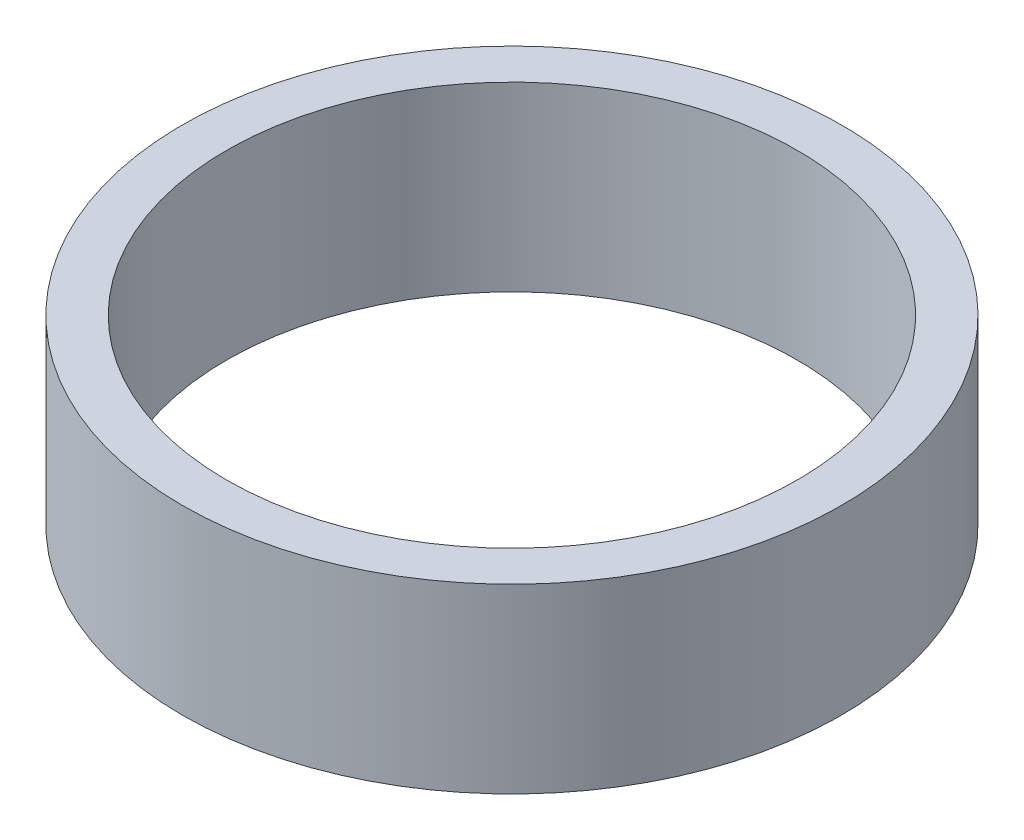
ISO-10303-21;
HEADER;
FILE_DESCRIPTION(('STEP AP214'),'2;1');
FILE_NAME('part.step','',(''),(''),'','','');
FILE_SCHEMA(('AUTOMOTIVE_DESIGN { 1 0 10303 214 1 1 1 1 }'));
ENDSEC;
DATA;
#1=APPLICATION_CONTEXT('core data for automotive mechanical design processes');
#2=APPLICATION_PROTOCOL_DEFINITION('international standard','automotive_design',2000,#1);
#3=PRODUCT_CONTEXT('',#1,'mechanical');
#4=PRODUCT('Part','Part','',(#3));
#5=PRODUCT_RELATED_PRODUCT_CATEGORY('part','',(#4));
#6=PRODUCT_DEFINITION_FORMATION('','',#4);
#7=PRODUCT_DEFINITION_CONTEXT('part definition',#1,'design');
#8=PRODUCT_DEFINITION('design','',#6,#7);
#9=PRODUCT_DEFINITION_SHAPE('','',#8);
#10=(LENGTH_UNIT() NAMED_UNIT(*) SI_UNIT(.MILLI.,.METRE.));
#11=(NAMED_UNIT(*) PLANE_ANGLE_UNIT() SI_UNIT($,.RADIAN.));
#12=(NAMED_UNIT(*) SI_UNIT($,.STERADIAN.) SOLID_ANGLE_UNIT());
#13=UNCERTAINTY_MEASURE_WITH_UNIT(LENGTH_MEASURE(1.E-05),#10,'distance_accuracy_value','');
#14=(GEOMETRIC_REPRESENTATION_CONTEXT(3) GLOBAL_UNCERTAINTY_ASSIGNED_CONTEXT((#13)) GLOBAL_UNIT_ASSIGNED_CONTEXT((#10,
#11,#12)) REPRESENTATION_CONTEXT('',''));
#15=CARTESIAN_POINT('',(0.,0.,0.));
#16=DIRECTION('',(0.,0.,1.));
#17=DIRECTION('',(1.,0.,0.));
#18=AXIS2_PLACEMENT_3D('',#15,#16,#17);
#19=CARTESIAN_POINT('',(0.,7.,0.));
#20=DIRECTION('',(0.,1.,0.));
#21=DIRECTION('',(0.,0.,1.));
#22=AXIS2_PLACEMENT_3D('',#19,#20,#21);
#23=PLANE('',#22);
#24=CARTESIAN_POINT('',(0.,7.,0.));
#25=DIRECTION('',(0.,1.,0.));
#26=DIRECTION('',(0.,0.,1.));
#27=AXIS2_PLACEMENT_3D('',#24,#25,#26);
#28=CIRCLE('',#27,12.7);
#29=CARTESIAN_POINT('',(0.,7.,12.7));
#30=VERTEX_POINT('',#29);
#31=EDGE_CURVE('E10',#30,#30,#28,.T.);
#32=ORIENTED_EDGE('',*,*,#31,.T.);
#33=EDGE_LOOP('',(#32));
#34=FACE_BOUND('',#33,.T.);
#35=CARTESIAN_POINT('',(0.,7.,0.));
#36=DIRECTION('',(0.,1.,0.));
#37=DIRECTION('',(0.,0.,1.));
#38=AXIS2_PLACEMENT_3D('',#35,#36,#37);
#39=CIRCLE('',#38,11.);
#40=CARTESIAN_POINT('',(0.,7.,11.));
#41=VERTEX_POINT('',#40);
#42=EDGE_CURVE('E54',#41,#41,#39,.T.);
#43=ORIENTED_EDGE('',*,*,#42,.F.);
#44=EDGE_LOOP('',(#43));
#45=FACE_BOUND('',#44,.T.);
#46=ADVANCED_FACE('F41',(#34,#45),#23,.T.);
#47=CARTESIAN_POINT('',(0.,0.,0.));
#48=DIRECTION('',(0.,1.,0.));
#49=DIRECTION('',(0.,0.,1.));
#50=AXIS2_PLACEMENT_3D('',#47,#48,#49);
#51=PLANE('',#50);
#52=CARTESIAN_POINT('',(0.,0.,0.));
#53=DIRECTION('',(0.,1.,0.));
#54=DIRECTION('',(0.,0.,1.));
#55=AXIS2_PLACEMENT_3D('',#52,#53,#54);
#56=CIRCLE('',#55,12.7);
#57=CARTESIAN_POINT('',(0.,0.,12.7));
#58=VERTEX_POINT('',#57);
#59=EDGE_CURVE('E45',#58,#58,#56,.T.);
#60=ORIENTED_EDGE('',*,*,#59,.F.);
#61=EDGE_LOOP('',(#60));
#62=FACE_BOUND('',#61,.T.);
#63=CARTESIAN_POINT('',(0.,0.,0.));
#64=DIRECTION('',(0.,1.,0.));
#65=DIRECTION('',(0.,0.,1.));
#66=AXIS2_PLACEMENT_3D('',#63,#64,#65);
#67=CIRCLE('',#66,11.);
#68=CARTESIAN_POINT('',(0.,0.,11.));
#69=VERTEX_POINT('',#68);
#70=EDGE_CURVE('E56',#69,#69,#67,.T.);
#71=ORIENTED_EDGE('',*,*,#70,.T.);
#72=EDGE_LOOP('',(#71));
#73=FACE_BOUND('',#72,.T.);
#74=ADVANCED_FACE('F68',(#62,#73),#51,.F.);
#75=CARTESIAN_POINT('',(0.,7.,0.));
#76=DIRECTION('',(0.,-1.,0.));
#77=DIRECTION('',(0.,0.,-1.));
#78=AXIS2_PLACEMENT_3D('',#75,#76,#77);
#79=CYLINDRICAL_SURFACE('',#78,12.7);
#80=ORIENTED_EDGE('',*,*,#31,.F.);
#81=EDGE_LOOP('',(#80));
#82=FACE_BOUND('',#81,.T.);
#83=ORIENTED_EDGE('',*,*,#59,.T.);
#84=EDGE_LOOP('',(#83));
#85=FACE_BOUND('',#84,.T.);
#86=ADVANCED_FACE('F43',(#82,#85),#79,.T.);
#87=CARTESIAN_POINT('',(0.,7.,0.));
#88=DIRECTION('',(0.,-1.,0.));
#89=DIRECTION('',(0.,0.,-1.));
#90=AXIS2_PLACEMENT_3D('',#87,#88,#89);
#91=CYLINDRICAL_SURFACE('',#90,11.);
#92=ORIENTED_EDGE('',*,*,#42,.T.);
#93=EDGE_LOOP('',(#92));
#94=FACE_BOUND('',#93,.T.);
#95=ORIENTED_EDGE('',*,*,#70,.F.);
#96=EDGE_LOOP('',(#95));
#97=FACE_BOUND('',#96,.T.);
#98=ADVANCED_FACE('F64',(#94,#97),#91,.F.);
#99=CLOSED_SHELL('',(#46,#74,#86,#98));
#100=MANIFOLD_SOLID_BREP('B2',#99);
#101=ADVANCED_BREP_SHAPE_REPRESENTATION('',(#18,#100),#14);
#102=SHAPE_DEFINITION_REPRESENTATION(#9,#101);
ENDSEC;
END-ISO-10303-21;
